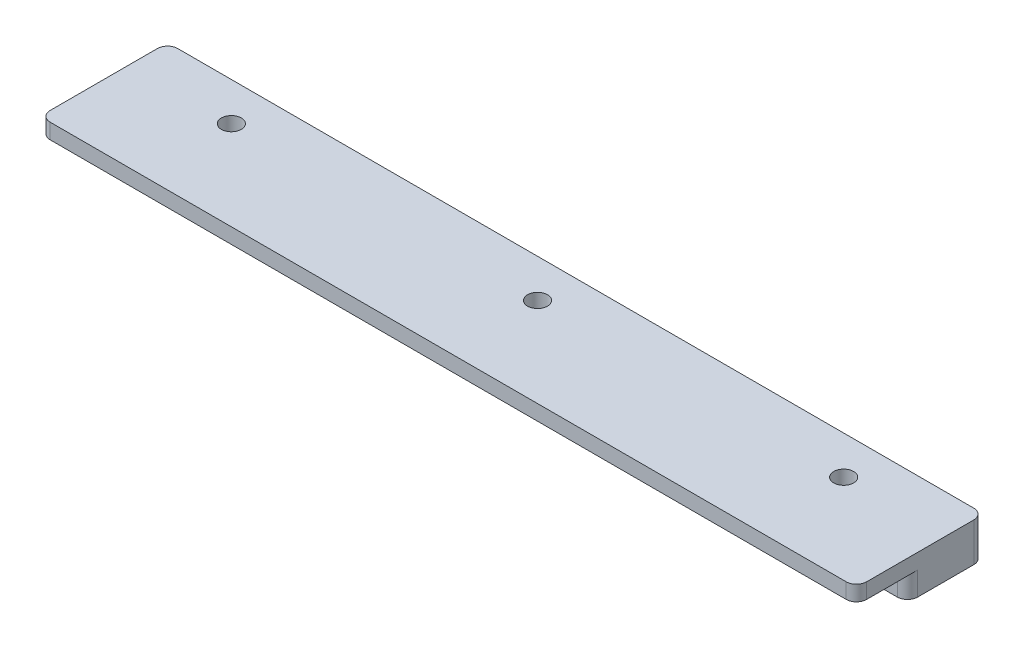
ISO-10303-21;
HEADER;
FILE_DESCRIPTION(('STEP AP214'),'2;1');
FILE_NAME('part.step','',(''),(''),'','','');
FILE_SCHEMA(('AUTOMOTIVE_DESIGN { 1 0 10303 214 1 1 1 1 }'));
ENDSEC;
DATA;
#1=APPLICATION_CONTEXT('core data for automotive mechanical design processes');
#2=APPLICATION_PROTOCOL_DEFINITION('international standard','automotive_design',2000,#1);
#3=PRODUCT_CONTEXT('',#1,'mechanical');
#4=PRODUCT('Part','Part','',(#3));
#5=PRODUCT_RELATED_PRODUCT_CATEGORY('part','',(#4));
#6=PRODUCT_DEFINITION_FORMATION('','',#4);
#7=PRODUCT_DEFINITION_CONTEXT('part definition',#1,'design');
#8=PRODUCT_DEFINITION('design','',#6,#7);
#9=PRODUCT_DEFINITION_SHAPE('','',#8);
#10=(LENGTH_UNIT() NAMED_UNIT(*) SI_UNIT(.MILLI.,.METRE.));
#11=(NAMED_UNIT(*) PLANE_ANGLE_UNIT() SI_UNIT($,.RADIAN.));
#12=(NAMED_UNIT(*) SI_UNIT($,.STERADIAN.) SOLID_ANGLE_UNIT());
#13=UNCERTAINTY_MEASURE_WITH_UNIT(LENGTH_MEASURE(1.E-05),#10,'distance_accuracy_value','');
#14=(GEOMETRIC_REPRESENTATION_CONTEXT(3) GLOBAL_UNCERTAINTY_ASSIGNED_CONTEXT((#13)) GLOBAL_UNIT_ASSIGNED_CONTEXT((#10,
#11,#12)) REPRESENTATION_CONTEXT('',''));
#15=CARTESIAN_POINT('',(0.,0.,0.));
#16=DIRECTION('',(0.,0.,1.));
#17=DIRECTION('',(1.,0.,0.));
#18=AXIS2_PLACEMENT_3D('',#15,#16,#17);
#19=CARTESIAN_POINT('',(160.,0.,15.));
#20=DIRECTION('',(0.,1.,0.));
#21=DIRECTION('',(0.,0.,1.));
#22=AXIS2_PLACEMENT_3D('',#19,#20,#21);
#23=PLANE('',#22);
#24=CARTESIAN_POINT('',(20.,0.,7.5));
#25=DIRECTION('',(0.,-1.,0.));
#26=DIRECTION('',(0.,0.,-1.));
#27=AXIS2_PLACEMENT_3D('',#24,#25,#26);
#28=CIRCLE('',#27,1.95);
#29=CARTESIAN_POINT('',(20.,0.,5.55));
#30=VERTEX_POINT('',#29);
#31=EDGE_CURVE('E414',#30,#30,#28,.T.);
#32=ORIENTED_EDGE('',*,*,#31,.F.);
#33=EDGE_LOOP('',(#32));
#34=FACE_BOUND('',#33,.T.);
#35=CARTESIAN_POINT('',(140.,0.,7.5));
#36=DIRECTION('',(0.,-1.,0.));
#37=DIRECTION('',(0.,0.,-1.));
#38=AXIS2_PLACEMENT_3D('',#35,#36,#37);
#39=CIRCLE('',#38,1.95);
#40=CARTESIAN_POINT('',(140.,0.,5.55));
#41=VERTEX_POINT('',#40);
#42=EDGE_CURVE('E407',#41,#41,#39,.T.);
#43=ORIENTED_EDGE('',*,*,#42,.F.);
#44=EDGE_LOOP('',(#43));
#45=FACE_BOUND('',#44,.T.);
#46=CARTESIAN_POINT('',(80.,0.,7.5));
#47=DIRECTION('',(0.,-1.,0.));
#48=DIRECTION('',(0.,0.,-1.));
#49=AXIS2_PLACEMENT_3D('',#46,#47,#48);
#50=CIRCLE('',#49,1.95);
#51=CARTESIAN_POINT('',(80.,0.,5.55));
#52=VERTEX_POINT('',#51);
#53=EDGE_CURVE('E408',#52,#52,#50,.T.);
#54=ORIENTED_EDGE('',*,*,#53,.F.);
#55=EDGE_LOOP('',(#54));
#56=FACE_BOUND('',#55,.T.);
#57=DIRECTION('',(0.,0.,-1.));
#58=VECTOR('',#57,1.);
#59=CARTESIAN_POINT('',(160.,0.,15.));
#60=LINE('',#59,#58);
#61=CARTESIAN_POINT('',(160.,0.,13.));
#62=VERTEX_POINT('',#61);
#63=CARTESIAN_POINT('',(160.,0.,2.));
#64=VERTEX_POINT('',#63);
#65=EDGE_CURVE('E142',#62,#64,#60,.T.);
#66=ORIENTED_EDGE('',*,*,#65,.F.);
#67=CARTESIAN_POINT('',(158.,0.,13.));
#68=DIRECTION('',(0.,1.,0.));
#69=DIRECTION('',(0.,0.,1.));
#70=AXIS2_PLACEMENT_3D('',#67,#68,#69);
#71=CIRCLE('',#70,2.);
#72=CARTESIAN_POINT('',(158.,0.,15.));
#73=VERTEX_POINT('',#72);
#74=EDGE_CURVE('E124',#62,#73,#71,.F.);
#75=ORIENTED_EDGE('',*,*,#74,.T.);
#76=DIRECTION('',(-1.,0.,0.));
#77=VECTOR('',#76,1.);
#78=CARTESIAN_POINT('',(160.,0.,15.));
#79=LINE('',#78,#77);
#80=CARTESIAN_POINT('',(2.,0.,15.));
#81=VERTEX_POINT('',#80);
#82=EDGE_CURVE('E163',#73,#81,#79,.T.);
#83=ORIENTED_EDGE('',*,*,#82,.T.);
#84=CARTESIAN_POINT('',(2.,0.,13.));
#85=DIRECTION('',(0.,1.,0.));
#86=DIRECTION('',(0.,0.,1.));
#87=AXIS2_PLACEMENT_3D('',#84,#85,#86);
#88=CIRCLE('',#87,2.);
#89=CARTESIAN_POINT('',(0.,0.,13.));
#90=VERTEX_POINT('',#89);
#91=EDGE_CURVE('E57',#81,#90,#88,.F.);
#92=ORIENTED_EDGE('',*,*,#91,.T.);
#93=DIRECTION('',(0.,0.,-1.));
#94=VECTOR('',#93,1.);
#95=CARTESIAN_POINT('',(0.,0.,15.));
#96=LINE('',#95,#94);
#97=CARTESIAN_POINT('',(0.,0.,2.));
#98=VERTEX_POINT('',#97);
#99=EDGE_CURVE('E164',#90,#98,#96,.T.);
#100=ORIENTED_EDGE('',*,*,#99,.T.);
#101=CARTESIAN_POINT('',(2.,0.,2.));
#102=DIRECTION('',(0.,1.,0.));
#103=DIRECTION('',(0.,0.,1.));
#104=AXIS2_PLACEMENT_3D('',#101,#102,#103);
#105=CIRCLE('',#104,2.);
#106=CARTESIAN_POINT('',(2.,0.,0.));
#107=VERTEX_POINT('',#106);
#108=EDGE_CURVE('E206',#98,#107,#105,.F.);
#109=ORIENTED_EDGE('',*,*,#108,.T.);
#110=DIRECTION('',(-1.,0.,0.));
#111=VECTOR('',#110,1.);
#112=CARTESIAN_POINT('',(160.,0.,0.));
#113=LINE('',#112,#111);
#114=CARTESIAN_POINT('',(158.,0.,0.));
#115=VERTEX_POINT('',#114);
#116=EDGE_CURVE('E183',#115,#107,#113,.T.);
#117=ORIENTED_EDGE('',*,*,#116,.F.);
#118=CARTESIAN_POINT('',(158.,0.,2.));
#119=DIRECTION('',(0.,1.,0.));
#120=DIRECTION('',(0.,0.,1.));
#121=AXIS2_PLACEMENT_3D('',#118,#119,#120);
#122=CIRCLE('',#121,2.);
#123=EDGE_CURVE('E135',#115,#64,#122,.F.);
#124=ORIENTED_EDGE('',*,*,#123,.T.);
#125=EDGE_LOOP('',(#66,#75,#83,#92,#100,#109,#117,#124));
#126=FACE_BOUND('',#125,.T.);
#127=ADVANCED_FACE('F35',(#34,#45,#56,#126),#23,.F.);
#128=CARTESIAN_POINT('',(160.,0.,0.));
#129=DIRECTION('',(0.,0.,1.));
#130=DIRECTION('',(1.,0.,0.));
#131=AXIS2_PLACEMENT_3D('',#128,#129,#130);
#132=PLANE('',#131);
#133=DIRECTION('',(-1.,0.,0.));
#134=VECTOR('',#133,1.);
#135=CARTESIAN_POINT('',(160.,7.6,0.));
#136=LINE('',#135,#134);
#137=CARTESIAN_POINT('',(158.,7.6,0.));
#138=VERTEX_POINT('',#137);
#139=CARTESIAN_POINT('',(2.,7.6,0.));
#140=VERTEX_POINT('',#139);
#141=EDGE_CURVE('E180',#138,#140,#136,.T.);
#142=ORIENTED_EDGE('',*,*,#141,.F.);
#143=DIRECTION('',(0.,1.,0.));
#144=VECTOR('',#143,1.);
#145=CARTESIAN_POINT('',(158.,0.,0.));
#146=LINE('',#145,#144);
#147=EDGE_CURVE('E214',#138,#115,#146,.F.);
#148=ORIENTED_EDGE('',*,*,#147,.T.);
#149=ORIENTED_EDGE('',*,*,#116,.T.);
#150=DIRECTION('',(0.,1.,0.));
#151=VECTOR('',#150,1.);
#152=CARTESIAN_POINT('',(2.,0.,0.));
#153=LINE('',#152,#151);
#154=EDGE_CURVE('E211',#107,#140,#153,.T.);
#155=ORIENTED_EDGE('',*,*,#154,.T.);
#156=EDGE_LOOP('',(#142,#148,#149,#155));
#157=FACE_BOUND('',#156,.T.);
#158=ADVANCED_FACE('F239',(#157),#132,.F.);
#159=CARTESIAN_POINT('',(160.,7.6,0.));
#160=DIRECTION('',(0.,-1.,0.));
#161=DIRECTION('',(0.,0.,-1.));
#162=AXIS2_PLACEMENT_3D('',#159,#160,#161);
#163=PLANE('',#162);
#164=CARTESIAN_POINT('',(20.,7.6,7.5));
#165=DIRECTION('',(0.,-1.,0.));
#166=DIRECTION('',(0.,0.,-1.));
#167=AXIS2_PLACEMENT_3D('',#164,#165,#166);
#168=CIRCLE('',#167,1.95);
#169=CARTESIAN_POINT('',(20.,7.6,5.55));
#170=VERTEX_POINT('',#169);
#171=EDGE_CURVE('E167',#170,#170,#168,.F.);
#172=ORIENTED_EDGE('',*,*,#171,.F.);
#173=EDGE_LOOP('',(#172));
#174=FACE_BOUND('',#173,.T.);
#175=CARTESIAN_POINT('',(140.,7.6,7.5));
#176=DIRECTION('',(0.,-1.,0.));
#177=DIRECTION('',(0.,0.,-1.));
#178=AXIS2_PLACEMENT_3D('',#175,#176,#177);
#179=CIRCLE('',#178,1.95);
#180=CARTESIAN_POINT('',(140.,7.6,5.55));
#181=VERTEX_POINT('',#180);
#182=EDGE_CURVE('E403',#181,#181,#179,.F.);
#183=ORIENTED_EDGE('',*,*,#182,.F.);
#184=EDGE_LOOP('',(#183));
#185=FACE_BOUND('',#184,.T.);
#186=CARTESIAN_POINT('',(80.,7.6,7.5));
#187=DIRECTION('',(0.,-1.,0.));
#188=DIRECTION('',(0.,0.,-1.));
#189=AXIS2_PLACEMENT_3D('',#186,#187,#188);
#190=CIRCLE('',#189,1.95);
#191=CARTESIAN_POINT('',(80.,7.6,5.55));
#192=VERTEX_POINT('',#191);
#193=EDGE_CURVE('E159',#192,#192,#190,.F.);
#194=ORIENTED_EDGE('',*,*,#193,.F.);
#195=EDGE_LOOP('',(#194));
#196=FACE_BOUND('',#195,.T.);
#197=DIRECTION('',(-1.,0.,0.));
#198=VECTOR('',#197,1.);
#199=CARTESIAN_POINT('',(160.,7.6,25.));
#200=LINE('',#199,#198);
#201=CARTESIAN_POINT('',(158.,7.6,25.));
#202=VERTEX_POINT('',#201);
#203=CARTESIAN_POINT('',(2.,7.6,25.));
#204=VERTEX_POINT('',#203);
#205=EDGE_CURVE('E177',#202,#204,#200,.T.);
#206=ORIENTED_EDGE('',*,*,#205,.F.);
#207=CARTESIAN_POINT('',(158.,7.6,23.));
#208=DIRECTION('',(0.,-1.,0.));
#209=DIRECTION('',(0.,0.,-1.));
#210=AXIS2_PLACEMENT_3D('',#207,#208,#209);
#211=CIRCLE('',#210,2.);
#212=CARTESIAN_POINT('',(160.,7.6,23.));
#213=VERTEX_POINT('',#212);
#214=EDGE_CURVE('E203',#202,#213,#211,.F.);
#215=ORIENTED_EDGE('',*,*,#214,.T.);
#216=DIRECTION('',(0.,0.,1.));
#217=VECTOR('',#216,1.);
#218=CARTESIAN_POINT('',(160.,7.6,0.));
#219=LINE('',#218,#217);
#220=CARTESIAN_POINT('',(160.,7.6,2.));
#221=VERTEX_POINT('',#220);
#222=EDGE_CURVE('E153',#221,#213,#219,.T.);
#223=ORIENTED_EDGE('',*,*,#222,.F.);
#224=CARTESIAN_POINT('',(158.,7.6,2.));
#225=DIRECTION('',(0.,-1.,0.));
#226=DIRECTION('',(0.,0.,-1.));
#227=AXIS2_PLACEMENT_3D('',#224,#225,#226);
#228=CIRCLE('',#227,2.);
#229=EDGE_CURVE('E201',#221,#138,#228,.F.);
#230=ORIENTED_EDGE('',*,*,#229,.T.);
#231=ORIENTED_EDGE('',*,*,#141,.T.);
#232=CARTESIAN_POINT('',(2.,7.6,2.));
#233=DIRECTION('',(0.,-1.,0.));
#234=DIRECTION('',(0.,0.,-1.));
#235=AXIS2_PLACEMENT_3D('',#232,#233,#234);
#236=CIRCLE('',#235,2.);
#237=CARTESIAN_POINT('',(0.,7.6,2.));
#238=VERTEX_POINT('',#237);
#239=EDGE_CURVE('E199',#140,#238,#236,.F.);
#240=ORIENTED_EDGE('',*,*,#239,.T.);
#241=DIRECTION('',(0.,0.,1.));
#242=VECTOR('',#241,1.);
#243=CARTESIAN_POINT('',(0.,7.6,0.));
#244=LINE('',#243,#242);
#245=CARTESIAN_POINT('',(0.,7.6,23.));
#246=VERTEX_POINT('',#245);
#247=EDGE_CURVE('E156',#238,#246,#244,.T.);
#248=ORIENTED_EDGE('',*,*,#247,.T.);
#249=CARTESIAN_POINT('',(2.,7.6,23.));
#250=DIRECTION('',(0.,-1.,0.));
#251=DIRECTION('',(0.,0.,-1.));
#252=AXIS2_PLACEMENT_3D('',#249,#250,#251);
#253=CIRCLE('',#252,2.);
#254=EDGE_CURVE('E197',#246,#204,#253,.F.);
#255=ORIENTED_EDGE('',*,*,#254,.T.);
#256=EDGE_LOOP('',(#206,#215,#223,#230,#231,#240,#248,#255));
#257=FACE_BOUND('',#256,.T.);
#258=ADVANCED_FACE('F243',(#174,#185,#196,#257),#163,.F.);
#259=CARTESIAN_POINT('',(160.,7.6,25.));
#260=DIRECTION('',(0.,0.,-1.));
#261=DIRECTION('',(-1.,0.,0.));
#262=AXIS2_PLACEMENT_3D('',#259,#260,#261);
#263=PLANE('',#262);
#264=DIRECTION('',(-1.,0.,0.));
#265=VECTOR('',#264,1.);
#266=CARTESIAN_POINT('',(160.,4.6,25.));
#267=LINE('',#266,#265);
#268=CARTESIAN_POINT('',(158.,4.6,25.));
#269=VERTEX_POINT('',#268);
#270=CARTESIAN_POINT('',(2.,4.6,25.));
#271=VERTEX_POINT('',#270);
#272=EDGE_CURVE('E174',#269,#271,#267,.T.);
#273=ORIENTED_EDGE('',*,*,#272,.F.);
#274=DIRECTION('',(0.,-1.,0.));
#275=VECTOR('',#274,1.);
#276=CARTESIAN_POINT('',(158.,7.6,25.));
#277=LINE('',#276,#275);
#278=EDGE_CURVE('E195',#269,#202,#277,.F.);
#279=ORIENTED_EDGE('',*,*,#278,.T.);
#280=ORIENTED_EDGE('',*,*,#205,.T.);
#281=DIRECTION('',(0.,-1.,0.));
#282=VECTOR('',#281,1.);
#283=CARTESIAN_POINT('',(2.,7.6,25.));
#284=LINE('',#283,#282);
#285=EDGE_CURVE('E192',#204,#271,#284,.T.);
#286=ORIENTED_EDGE('',*,*,#285,.T.);
#287=EDGE_LOOP('',(#273,#279,#280,#286));
#288=FACE_BOUND('',#287,.T.);
#289=ADVANCED_FACE('F254',(#288),#263,.F.);
#290=CARTESIAN_POINT('',(160.,4.6,25.));
#291=DIRECTION('',(0.,1.,0.));
#292=DIRECTION('',(0.,0.,1.));
#293=AXIS2_PLACEMENT_3D('',#290,#291,#292);
#294=PLANE('',#293);
#295=DIRECTION('',(0.,0.,-1.));
#296=VECTOR('',#295,1.);
#297=CARTESIAN_POINT('',(160.,4.6,25.));
#298=LINE('',#297,#296);
#299=CARTESIAN_POINT('',(160.,4.6,23.));
#300=VERTEX_POINT('',#299);
#301=CARTESIAN_POINT('',(160.,4.6,13.));
#302=VERTEX_POINT('',#301);
#303=EDGE_CURVE('E146',#300,#302,#298,.T.);
#304=ORIENTED_EDGE('',*,*,#303,.F.);
#305=CARTESIAN_POINT('',(158.,4.6,23.));
#306=DIRECTION('',(0.,1.,0.));
#307=DIRECTION('',(0.,0.,1.));
#308=AXIS2_PLACEMENT_3D('',#305,#306,#307);
#309=CIRCLE('',#308,2.);
#310=EDGE_CURVE('E190',#300,#269,#309,.F.);
#311=ORIENTED_EDGE('',*,*,#310,.T.);
#312=ORIENTED_EDGE('',*,*,#272,.T.);
#313=CARTESIAN_POINT('',(2.,4.6,23.));
#314=DIRECTION('',(0.,1.,0.));
#315=DIRECTION('',(0.,0.,1.));
#316=AXIS2_PLACEMENT_3D('',#313,#314,#315);
#317=CIRCLE('',#316,2.);
#318=CARTESIAN_POINT('',(0.,4.6,23.));
#319=VERTEX_POINT('',#318);
#320=EDGE_CURVE('E188',#271,#319,#317,.F.);
#321=ORIENTED_EDGE('',*,*,#320,.T.);
#322=DIRECTION('',(0.,0.,-1.));
#323=VECTOR('',#322,1.);
#324=CARTESIAN_POINT('',(0.,4.6,25.));
#325=LINE('',#324,#323);
#326=CARTESIAN_POINT('',(0.,4.6,13.));
#327=VERTEX_POINT('',#326);
#328=EDGE_CURVE('E49',#319,#327,#325,.T.);
#329=ORIENTED_EDGE('',*,*,#328,.T.);
#330=CARTESIAN_POINT('',(2.,4.6,13.));
#331=DIRECTION('',(0.,1.,0.));
#332=DIRECTION('',(0.,0.,1.));
#333=AXIS2_PLACEMENT_3D('',#330,#331,#332);
#334=CIRCLE('',#333,2.);
#335=CARTESIAN_POINT('',(2.,4.6,15.));
#336=VERTEX_POINT('',#335);
#337=EDGE_CURVE('E11',#327,#336,#334,.T.);
#338=ORIENTED_EDGE('',*,*,#337,.T.);
#339=DIRECTION('',(-1.,0.,0.));
#340=VECTOR('',#339,1.);
#341=CARTESIAN_POINT('',(160.,4.6,15.));
#342=LINE('',#341,#340);
#343=CARTESIAN_POINT('',(158.,4.6,15.));
#344=VERTEX_POINT('',#343);
#345=EDGE_CURVE('E171',#344,#336,#342,.T.);
#346=ORIENTED_EDGE('',*,*,#345,.F.);
#347=CARTESIAN_POINT('',(158.,4.6,13.));
#348=DIRECTION('',(0.,1.,0.));
#349=DIRECTION('',(0.,0.,1.));
#350=AXIS2_PLACEMENT_3D('',#347,#348,#349);
#351=CIRCLE('',#350,2.);
#352=EDGE_CURVE('E43',#344,#302,#351,.T.);
#353=ORIENTED_EDGE('',*,*,#352,.T.);
#354=EDGE_LOOP('',(#304,#311,#312,#321,#329,#338,#346,#353));
#355=FACE_BOUND('',#354,.T.);
#356=ADVANCED_FACE('F222',(#355),#294,.F.);
#357=CARTESIAN_POINT('',(160.,4.6,15.));
#358=DIRECTION('',(0.,0.,-1.));
#359=DIRECTION('',(-1.,0.,0.));
#360=AXIS2_PLACEMENT_3D('',#357,#358,#359);
#361=PLANE('',#360);
#362=ORIENTED_EDGE('',*,*,#82,.F.);
#363=DIRECTION('',(0.,-1.,0.));
#364=VECTOR('',#363,1.);
#365=CARTESIAN_POINT('',(158.,4.6,15.));
#366=LINE('',#365,#364);
#367=EDGE_CURVE('E129',#73,#344,#366,.F.);
#368=ORIENTED_EDGE('',*,*,#367,.T.);
#369=ORIENTED_EDGE('',*,*,#345,.T.);
#370=DIRECTION('',(0.,-1.,0.));
#371=VECTOR('',#370,1.);
#372=CARTESIAN_POINT('',(2.,4.6,15.));
#373=LINE('',#372,#371);
#374=EDGE_CURVE('E134',#336,#81,#373,.T.);
#375=ORIENTED_EDGE('',*,*,#374,.T.);
#376=EDGE_LOOP('',(#362,#368,#369,#375));
#377=FACE_BOUND('',#376,.T.);
#378=ADVANCED_FACE('F225',(#377),#361,.F.);
#379=CARTESIAN_POINT('',(160.,0.,0.));
#380=DIRECTION('',(1.,0.,0.));
#381=DIRECTION('',(0.,0.,-1.));
#382=AXIS2_PLACEMENT_3D('',#379,#380,#381);
#383=PLANE('',#382);
#384=ORIENTED_EDGE('',*,*,#222,.T.);
#385=DIRECTION('',(0.,-1.,0.));
#386=VECTOR('',#385,1.);
#387=CARTESIAN_POINT('',(160.,4.6,23.));
#388=LINE('',#387,#386);
#389=EDGE_CURVE('E148',#213,#300,#388,.T.);
#390=ORIENTED_EDGE('',*,*,#389,.T.);
#391=ORIENTED_EDGE('',*,*,#303,.T.);
#392=DIRECTION('',(0.,-1.,0.));
#393=VECTOR('',#392,1.);
#394=CARTESIAN_POINT('',(160.,0.,13.));
#395=LINE('',#394,#393);
#396=EDGE_CURVE('E128',#302,#62,#395,.T.);
#397=ORIENTED_EDGE('',*,*,#396,.T.);
#398=ORIENTED_EDGE('',*,*,#65,.T.);
#399=DIRECTION('',(0.,1.,0.));
#400=VECTOR('',#399,1.);
#401=CARTESIAN_POINT('',(160.,7.6,2.));
#402=LINE('',#401,#400);
#403=EDGE_CURVE('E149',#64,#221,#402,.T.);
#404=ORIENTED_EDGE('',*,*,#403,.T.);
#405=EDGE_LOOP('',(#384,#390,#391,#397,#398,#404));
#406=FACE_BOUND('',#405,.T.);
#407=ADVANCED_FACE('F140',(#406),#383,.T.);
#408=CARTESIAN_POINT('',(0.,0.,0.));
#409=DIRECTION('',(1.,0.,0.));
#410=DIRECTION('',(0.,0.,-1.));
#411=AXIS2_PLACEMENT_3D('',#408,#409,#410);
#412=PLANE('',#411);
#413=ORIENTED_EDGE('',*,*,#247,.F.);
#414=DIRECTION('',(0.,1.,0.));
#415=VECTOR('',#414,1.);
#416=CARTESIAN_POINT('',(0.,0.,2.));
#417=LINE('',#416,#415);
#418=EDGE_CURVE('E220',#238,#98,#417,.F.);
#419=ORIENTED_EDGE('',*,*,#418,.T.);
#420=ORIENTED_EDGE('',*,*,#99,.F.);
#421=DIRECTION('',(0.,-1.,0.));
#422=VECTOR('',#421,1.);
#423=CARTESIAN_POINT('',(0.,0.,13.));
#424=LINE('',#423,#422);
#425=EDGE_CURVE('E218',#90,#327,#424,.F.);
#426=ORIENTED_EDGE('',*,*,#425,.T.);
#427=ORIENTED_EDGE('',*,*,#328,.F.);
#428=DIRECTION('',(0.,-1.,0.));
#429=VECTOR('',#428,1.);
#430=CARTESIAN_POINT('',(0.,0.,23.));
#431=LINE('',#430,#429);
#432=EDGE_CURVE('E216',#319,#246,#431,.F.);
#433=ORIENTED_EDGE('',*,*,#432,.T.);
#434=EDGE_LOOP('',(#413,#419,#420,#426,#427,#433));
#435=FACE_BOUND('',#434,.T.);
#436=ADVANCED_FACE('F230',(#435),#412,.F.);
#437=CARTESIAN_POINT('',(80.,7.601,7.5));
#438=DIRECTION('',(0.,-1.,0.));
#439=DIRECTION('',(0.,0.,-1.));
#440=AXIS2_PLACEMENT_3D('',#437,#438,#439);
#441=CYLINDRICAL_SURFACE('',#440,1.95);
#442=ORIENTED_EDGE('',*,*,#53,.T.);
#443=EDGE_LOOP('',(#442));
#444=FACE_BOUND('',#443,.T.);
#445=ORIENTED_EDGE('',*,*,#193,.T.);
#446=EDGE_LOOP('',(#445));
#447=FACE_BOUND('',#446,.T.);
#448=ADVANCED_FACE('F329',(#444,#447),#441,.F.);
#449=CARTESIAN_POINT('',(140.,7.601,7.5));
#450=DIRECTION('',(0.,-1.,0.));
#451=DIRECTION('',(0.,0.,-1.));
#452=AXIS2_PLACEMENT_3D('',#449,#450,#451);
#453=CYLINDRICAL_SURFACE('',#452,1.95);
#454=ORIENTED_EDGE('',*,*,#42,.T.);
#455=EDGE_LOOP('',(#454));
#456=FACE_BOUND('',#455,.T.);
#457=ORIENTED_EDGE('',*,*,#182,.T.);
#458=EDGE_LOOP('',(#457));
#459=FACE_BOUND('',#458,.T.);
#460=ADVANCED_FACE('F320',(#456,#459),#453,.F.);
#461=CARTESIAN_POINT('',(20.,7.601,7.5));
#462=DIRECTION('',(0.,-1.,0.));
#463=DIRECTION('',(0.,0.,-1.));
#464=AXIS2_PLACEMENT_3D('',#461,#462,#463);
#465=CYLINDRICAL_SURFACE('',#464,1.95);
#466=ORIENTED_EDGE('',*,*,#31,.T.);
#467=EDGE_LOOP('',(#466));
#468=FACE_BOUND('',#467,.T.);
#469=ORIENTED_EDGE('',*,*,#171,.T.);
#470=EDGE_LOOP('',(#469));
#471=FACE_BOUND('',#470,.T.);
#472=ADVANCED_FACE('F276',(#468,#471),#465,.F.);
#473=CARTESIAN_POINT('',(158.,0.,23.));
#474=DIRECTION('',(0.,1.,0.));
#475=DIRECTION('',(0.,0.,1.));
#476=AXIS2_PLACEMENT_3D('',#473,#474,#475);
#477=CYLINDRICAL_SURFACE('',#476,2.);
#478=ORIENTED_EDGE('',*,*,#214,.F.);
#479=ORIENTED_EDGE('',*,*,#278,.F.);
#480=ORIENTED_EDGE('',*,*,#310,.F.);
#481=ORIENTED_EDGE('',*,*,#389,.F.);
#482=EDGE_LOOP('',(#478,#479,#480,#481));
#483=FACE_BOUND('',#482,.T.);
#484=ADVANCED_FACE('F250',(#483),#477,.T.);
#485=CARTESIAN_POINT('',(158.,0.,13.));
#486=DIRECTION('',(0.,1.,0.));
#487=DIRECTION('',(0.,0.,1.));
#488=AXIS2_PLACEMENT_3D('',#485,#486,#487);
#489=CYLINDRICAL_SURFACE('',#488,2.);
#490=ORIENTED_EDGE('',*,*,#352,.F.);
#491=ORIENTED_EDGE('',*,*,#367,.F.);
#492=ORIENTED_EDGE('',*,*,#74,.F.);
#493=ORIENTED_EDGE('',*,*,#396,.F.);
#494=EDGE_LOOP('',(#490,#491,#492,#493));
#495=FACE_BOUND('',#494,.T.);
#496=ADVANCED_FACE('F127',(#495),#489,.T.);
#497=CARTESIAN_POINT('',(158.,0.,2.));
#498=DIRECTION('',(0.,-1.,0.));
#499=DIRECTION('',(0.,0.,-1.));
#500=AXIS2_PLACEMENT_3D('',#497,#498,#499);
#501=CYLINDRICAL_SURFACE('',#500,2.);
#502=ORIENTED_EDGE('',*,*,#123,.F.);
#503=ORIENTED_EDGE('',*,*,#147,.F.);
#504=ORIENTED_EDGE('',*,*,#229,.F.);
#505=ORIENTED_EDGE('',*,*,#403,.F.);
#506=EDGE_LOOP('',(#502,#503,#504,#505));
#507=FACE_BOUND('',#506,.T.);
#508=ADVANCED_FACE('F246',(#507),#501,.T.);
#509=CARTESIAN_POINT('',(2.,0.,2.));
#510=DIRECTION('',(0.,1.,0.));
#511=DIRECTION('',(0.,0.,1.));
#512=AXIS2_PLACEMENT_3D('',#509,#510,#511);
#513=CYLINDRICAL_SURFACE('',#512,2.);
#514=ORIENTED_EDGE('',*,*,#108,.F.);
#515=ORIENTED_EDGE('',*,*,#418,.F.);
#516=ORIENTED_EDGE('',*,*,#239,.F.);
#517=ORIENTED_EDGE('',*,*,#154,.F.);
#518=EDGE_LOOP('',(#514,#515,#516,#517));
#519=FACE_BOUND('',#518,.T.);
#520=ADVANCED_FACE('F236',(#519),#513,.T.);
#521=CARTESIAN_POINT('',(2.,4.6,13.));
#522=DIRECTION('',(0.,-1.,0.));
#523=DIRECTION('',(0.,0.,-1.));
#524=AXIS2_PLACEMENT_3D('',#521,#522,#523);
#525=CYLINDRICAL_SURFACE('',#524,2.);
#526=ORIENTED_EDGE('',*,*,#337,.F.);
#527=ORIENTED_EDGE('',*,*,#425,.F.);
#528=ORIENTED_EDGE('',*,*,#91,.F.);
#529=ORIENTED_EDGE('',*,*,#374,.F.);
#530=EDGE_LOOP('',(#526,#527,#528,#529));
#531=FACE_BOUND('',#530,.T.);
#532=ADVANCED_FACE('F226',(#531),#525,.T.);
#533=CARTESIAN_POINT('',(2.,7.6,23.));
#534=DIRECTION('',(0.,-1.,0.));
#535=DIRECTION('',(0.,0.,-1.));
#536=AXIS2_PLACEMENT_3D('',#533,#534,#535);
#537=CYLINDRICAL_SURFACE('',#536,2.);
#538=ORIENTED_EDGE('',*,*,#254,.F.);
#539=ORIENTED_EDGE('',*,*,#432,.F.);
#540=ORIENTED_EDGE('',*,*,#320,.F.);
#541=ORIENTED_EDGE('',*,*,#285,.F.);
#542=EDGE_LOOP('',(#538,#539,#540,#541));
#543=FACE_BOUND('',#542,.T.);
#544=ADVANCED_FACE('F37',(#543),#537,.T.);
#545=CLOSED_SHELL('',(#127,#158,#258,#289,#356,#378,#407,#436,#448,#460,#472,#484,#496,#508,
#520,#532,#544));
#546=MANIFOLD_SOLID_BREP('B2',#545);
#547=ADVANCED_BREP_SHAPE_REPRESENTATION('',(#18,#546),#14);
#548=SHAPE_DEFINITION_REPRESENTATION(#9,#547);
ENDSEC;
END-ISO-10303-21;
